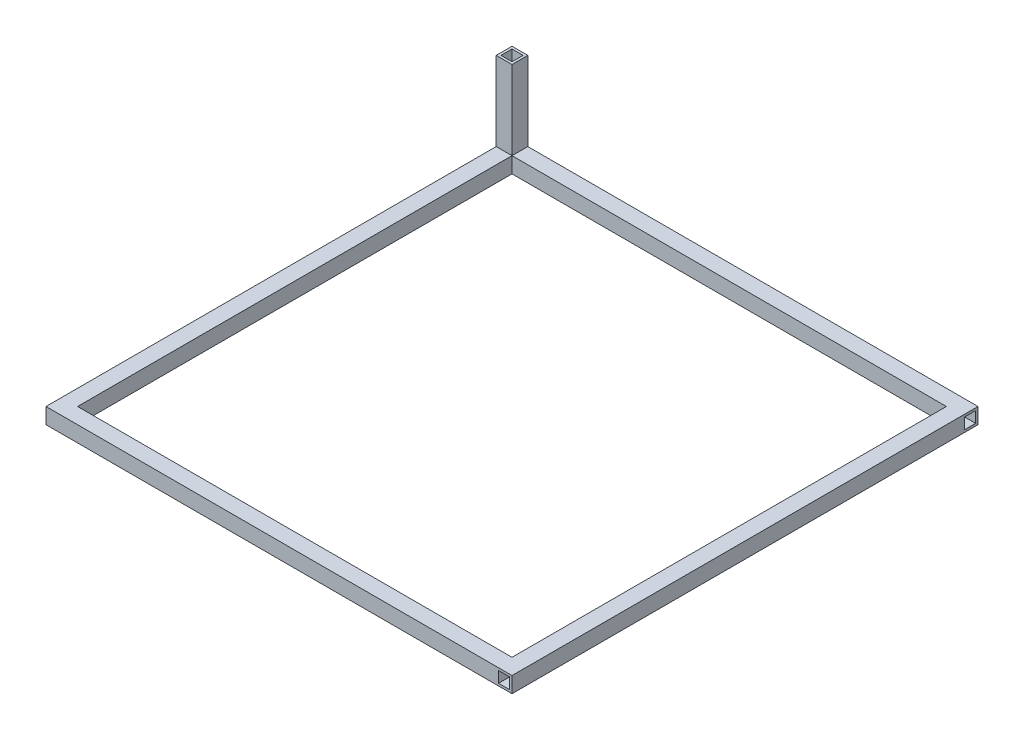
ISO-10303-21;
HEADER;
FILE_DESCRIPTION(('STEP AP214'),'2;1');
FILE_NAME('part.step','',(''),(''),'','','');
FILE_SCHEMA(('AUTOMOTIVE_DESIGN { 1 0 10303 214 1 1 1 1 }'));
ENDSEC;
DATA;
#1=APPLICATION_CONTEXT('core data for automotive mechanical design processes');
#2=APPLICATION_PROTOCOL_DEFINITION('international standard','automotive_design',2000,#1);
#3=PRODUCT_CONTEXT('',#1,'mechanical');
#4=PRODUCT('Part','Part','',(#3));
#5=PRODUCT_RELATED_PRODUCT_CATEGORY('part','',(#4));
#6=PRODUCT_DEFINITION_FORMATION('','',#4);
#7=PRODUCT_DEFINITION_CONTEXT('part definition',#1,'design');
#8=PRODUCT_DEFINITION('design','',#6,#7);
#9=PRODUCT_DEFINITION_SHAPE('','',#8);
#10=(LENGTH_UNIT() NAMED_UNIT(*) SI_UNIT(.MILLI.,.METRE.));
#11=(NAMED_UNIT(*) PLANE_ANGLE_UNIT() SI_UNIT($,.RADIAN.));
#12=(NAMED_UNIT(*) SI_UNIT($,.STERADIAN.) SOLID_ANGLE_UNIT());
#13=UNCERTAINTY_MEASURE_WITH_UNIT(LENGTH_MEASURE(1.E-05),#10,'distance_accuracy_value','');
#14=(GEOMETRIC_REPRESENTATION_CONTEXT(3) GLOBAL_UNCERTAINTY_ASSIGNED_CONTEXT((#13)) GLOBAL_UNIT_ASSIGNED_CONTEXT((#10,
#11,#12)) REPRESENTATION_CONTEXT('',''));
#15=CARTESIAN_POINT('',(0.,0.,0.));
#16=DIRECTION('',(0.,0.,1.));
#17=DIRECTION('',(1.,0.,0.));
#18=AXIS2_PLACEMENT_3D('',#15,#16,#17);
#19=CARTESIAN_POINT('',(500.495049504951,30.9955771126084,590.));
#20=DIRECTION('',(1.,0.,0.));
#21=DIRECTION('',(0.,0.,-1.));
#22=AXIS2_PLACEMENT_3D('',#19,#20,#21);
#23=PLANE('',#22);
#24=DIRECTION('',(0.,-1.,0.));
#25=VECTOR('',#24,1.);
#26=CARTESIAN_POINT('',(500.495049504951,30.9955771126084,570.));
#27=LINE('',#26,#25);
#28=CARTESIAN_POINT('',(500.495049504951,30.9955771126084,570.));
#29=VERTEX_POINT('',#28);
#30=CARTESIAN_POINT('',(500.495049504951,10.9955771126084,570.));
#31=VERTEX_POINT('',#30);
#32=EDGE_CURVE('E255',#29,#31,#27,.T.);
#33=ORIENTED_EDGE('',*,*,#32,.F.);
#34=DIRECTION('',(0.,0.,-1.));
#35=VECTOR('',#34,1.);
#36=CARTESIAN_POINT('',(500.495049504951,30.9955771126084,590.));
#37=LINE('',#36,#35);
#38=CARTESIAN_POINT('',(500.495049504951,30.9955771126084,20.));
#39=VERTEX_POINT('',#38);
#40=EDGE_CURVE('E330',#29,#39,#37,.T.);
#41=ORIENTED_EDGE('',*,*,#40,.T.);
#42=DIRECTION('',(0.,-1.,0.));
#43=VECTOR('',#42,1.);
#44=CARTESIAN_POINT('',(500.495049504951,30.9955771126084,20.));
#45=LINE('',#44,#43);
#46=CARTESIAN_POINT('',(500.495049504951,10.9955771126084,20.));
#47=VERTEX_POINT('',#46);
#48=EDGE_CURVE('E318',#39,#47,#45,.T.);
#49=ORIENTED_EDGE('',*,*,#48,.T.);
#50=DIRECTION('',(0.,0.,-1.));
#51=VECTOR('',#50,1.);
#52=CARTESIAN_POINT('',(500.495049504951,10.9955771126084,590.));
#53=LINE('',#52,#51);
#54=EDGE_CURVE('E60',#31,#47,#53,.T.);
#55=ORIENTED_EDGE('',*,*,#54,.F.);
#56=EDGE_LOOP('',(#33,#41,#49,#55));
#57=FACE_BOUND('',#56,.T.);
#58=ADVANCED_FACE('F37',(#57),#23,.F.);
#59=CARTESIAN_POINT('',(520.495049504951,30.9955771126084,20.));
#60=DIRECTION('',(0.,0.,-1.));
#61=DIRECTION('',(-1.,0.,0.));
#62=AXIS2_PLACEMENT_3D('',#59,#60,#61);
#63=PLANE('',#62);
#64=ORIENTED_EDGE('',*,*,#48,.F.);
#65=DIRECTION('',(-1.,0.,0.));
#66=VECTOR('',#65,1.);
#67=CARTESIAN_POINT('',(520.495049504951,30.9955771126084,20.));
#68=LINE('',#67,#66);
#69=CARTESIAN_POINT('',(-49.5049504950495,30.9955771126084,20.));
#70=VERTEX_POINT('',#69);
#71=EDGE_CURVE('E371',#39,#70,#68,.T.);
#72=ORIENTED_EDGE('',*,*,#71,.T.);
#73=DIRECTION('',(0.,-1.,0.));
#74=VECTOR('',#73,1.);
#75=CARTESIAN_POINT('',(-49.5049504950495,30.9955771126084,20.));
#76=LINE('',#75,#74);
#77=CARTESIAN_POINT('',(-49.5049504950495,10.9955771126084,20.));
#78=VERTEX_POINT('',#77);
#79=EDGE_CURVE('E362',#70,#78,#76,.T.);
#80=ORIENTED_EDGE('',*,*,#79,.T.);
#81=DIRECTION('',(-1.,0.,0.));
#82=VECTOR('',#81,1.);
#83=CARTESIAN_POINT('',(520.495049504951,10.9955771126084,20.));
#84=LINE('',#83,#82);
#85=EDGE_CURVE('E380',#47,#78,#84,.T.);
#86=ORIENTED_EDGE('',*,*,#85,.F.);
#87=EDGE_LOOP('',(#64,#72,#80,#86));
#88=FACE_BOUND('',#87,.T.);
#89=ADVANCED_FACE('F491',(#88),#63,.F.);
#90=CARTESIAN_POINT('',(-49.5049504950495,30.9955771126084,570.));
#91=DIRECTION('',(-1.,0.,0.));
#92=DIRECTION('',(0.,0.,1.));
#93=AXIS2_PLACEMENT_3D('',#90,#91,#92);
#94=PLANE('',#93);
#95=ORIENTED_EDGE('',*,*,#79,.F.);
#96=DIRECTION('',(0.,0.,-1.));
#97=VECTOR('',#96,1.);
#98=CARTESIAN_POINT('',(-49.5049504950495,30.9955771126084,570.));
#99=LINE('',#98,#97);
#100=CARTESIAN_POINT('',(-49.5049504950495,30.9955771126084,570.));
#101=VERTEX_POINT('',#100);
#102=EDGE_CURVE('E479',#101,#70,#99,.T.);
#103=ORIENTED_EDGE('',*,*,#102,.F.);
#104=DIRECTION('',(0.,1.,0.));
#105=VECTOR('',#104,1.);
#106=CARTESIAN_POINT('',(-49.5049504950495,30.9955771126084,570.));
#107=LINE('',#106,#105);
#108=CARTESIAN_POINT('',(-49.5049504950495,10.9955771126084,570.));
#109=VERTEX_POINT('',#108);
#110=EDGE_CURVE('E467',#109,#101,#107,.T.);
#111=ORIENTED_EDGE('',*,*,#110,.F.);
#112=DIRECTION('',(0.,0.,-1.));
#113=VECTOR('',#112,1.);
#114=CARTESIAN_POINT('',(-49.5049504950495,10.9955771126084,570.));
#115=LINE('',#114,#113);
#116=EDGE_CURVE('E45',#109,#78,#115,.T.);
#117=ORIENTED_EDGE('',*,*,#116,.T.);
#118=EDGE_LOOP('',(#95,#103,#111,#117));
#119=FACE_BOUND('',#118,.T.);
#120=ADVANCED_FACE('F485',(#119),#94,.F.);
#121=DIRECTION('',(0.,0.,1.));
#122=VECTOR('',#121,1.);
#123=CARTESIAN_POINT('',(-49.5049504950495,30.9955771126084,20.));
#124=LINE('',#123,#122);
#125=CARTESIAN_POINT('',(-49.5049504950495,30.9955771126084,0.));
#126=VERTEX_POINT('',#125);
#127=EDGE_CURVE('E367',#126,#70,#124,.T.);
#128=ORIENTED_EDGE('',*,*,#127,.F.);
#129=DIRECTION('',(0.,1.,0.));
#130=VECTOR('',#129,1.);
#131=CARTESIAN_POINT('',(-49.5049504950495,30.9955771126084,0.));
#132=LINE('',#131,#130);
#133=CARTESIAN_POINT('',(-49.5049504950495,130.995577112608,0.));
#134=VERTEX_POINT('',#133);
#135=EDGE_CURVE('E471',#126,#134,#132,.T.);
#136=ORIENTED_EDGE('',*,*,#135,.T.);
#137=DIRECTION('',(0.,0.,-1.));
#138=VECTOR('',#137,1.);
#139=CARTESIAN_POINT('',(-49.5049504950495,130.995577112608,0.));
#140=LINE('',#139,#138);
#141=CARTESIAN_POINT('',(-49.5049504950495,130.995577112608,20.));
#142=VERTEX_POINT('',#141);
#143=EDGE_CURVE('E418',#142,#134,#140,.T.);
#144=ORIENTED_EDGE('',*,*,#143,.F.);
#145=DIRECTION('',(0.,-1.,0.));
#146=VECTOR('',#145,1.);
#147=CARTESIAN_POINT('',(-49.5049504950495,130.995577112608,20.));
#148=LINE('',#147,#146);
#149=EDGE_CURVE('E424',#142,#70,#148,.T.);
#150=ORIENTED_EDGE('',*,*,#149,.T.);
#151=EDGE_LOOP('',(#128,#136,#144,#150));
#152=FACE_BOUND('',#151,.T.);
#153=ADVANCED_FACE('F497',(#152),#94,.F.);
#154=CARTESIAN_POINT('',(-69.5049504950495,30.9955771126084,570.));
#155=DIRECTION('',(0.,-1.,0.));
#156=DIRECTION('',(0.,0.,-1.));
#157=AXIS2_PLACEMENT_3D('',#154,#155,#156);
#158=PLANE('',#157);
#159=DIRECTION('',(1.,0.,0.));
#160=VECTOR('',#159,1.);
#161=CARTESIAN_POINT('',(-69.5049504950495,30.9955771126084,20.));
#162=LINE('',#161,#160);
#163=CARTESIAN_POINT('',(-69.5049504950495,30.9955771126084,20.));
#164=VERTEX_POINT('',#163);
#165=EDGE_CURVE('E412',#164,#70,#162,.T.);
#166=ORIENTED_EDGE('',*,*,#165,.F.);
#167=DIRECTION('',(0.,0.,-1.));
#168=VECTOR('',#167,1.);
#169=CARTESIAN_POINT('',(-69.5049504950495,30.9955771126084,570.));
#170=LINE('',#169,#168);
#171=CARTESIAN_POINT('',(-69.5049504950495,30.9955771126084,590.));
#172=VERTEX_POINT('',#171);
#173=EDGE_CURVE('E470',#172,#164,#170,.T.);
#174=ORIENTED_EDGE('',*,*,#173,.F.);
#175=DIRECTION('',(-1.,0.,0.));
#176=VECTOR('',#175,1.);
#177=CARTESIAN_POINT('',(520.495049504951,30.9955771126084,590.));
#178=LINE('',#177,#176);
#179=CARTESIAN_POINT('',(520.495049504951,30.9955771126084,590.));
#180=VERTEX_POINT('',#179);
#181=EDGE_CURVE('E322',#180,#172,#178,.T.);
#182=ORIENTED_EDGE('',*,*,#181,.F.);
#183=DIRECTION('',(0.,0.,1.));
#184=VECTOR('',#183,1.);
#185=CARTESIAN_POINT('',(520.495049504951,30.9955771126084,20.));
#186=LINE('',#185,#184);
#187=CARTESIAN_POINT('',(520.495049504951,30.9955771126084,0.));
#188=VERTEX_POINT('',#187);
#189=EDGE_CURVE('E369',#188,#180,#186,.T.);
#190=ORIENTED_EDGE('',*,*,#189,.F.);
#191=DIRECTION('',(-1.,0.,0.));
#192=VECTOR('',#191,1.);
#193=CARTESIAN_POINT('',(520.495049504951,30.9955771126084,0.));
#194=LINE('',#193,#192);
#195=EDGE_CURVE('E377',#188,#126,#194,.T.);
#196=ORIENTED_EDGE('',*,*,#195,.T.);
#197=ORIENTED_EDGE('',*,*,#127,.T.);
#198=ORIENTED_EDGE('',*,*,#71,.F.);
#199=ORIENTED_EDGE('',*,*,#40,.F.);
#200=DIRECTION('',(1.,0.,0.));
#201=VECTOR('',#200,1.);
#202=CARTESIAN_POINT('',(-69.5049504950495,30.9955771126084,570.));
#203=LINE('',#202,#201);
#204=EDGE_CURVE('E281',#101,#29,#203,.T.);
#205=ORIENTED_EDGE('',*,*,#204,.F.);
#206=ORIENTED_EDGE('',*,*,#102,.T.);
#207=EDGE_LOOP('',(#166,#174,#182,#190,#196,#197,#198,#199,#205,#206));
#208=FACE_BOUND('',#207,.T.);
#209=ADVANCED_FACE('F503',(#208),#158,.F.);
#210=CARTESIAN_POINT('',(0.,0.,0.));
#211=DIRECTION('',(0.,0.,1.));
#212=DIRECTION('',(1.,0.,0.));
#213=AXIS2_PLACEMENT_3D('',#210,#211,#212);
#214=PLANE('',#213);
#215=DIRECTION('',(0.,-1.,0.));
#216=VECTOR('',#215,1.);
#217=CARTESIAN_POINT('',(-69.5049504950495,30.9955771126084,0.));
#218=LINE('',#217,#216);
#219=CARTESIAN_POINT('',(-69.5049504950495,130.995577112608,0.));
#220=VERTEX_POINT('',#219);
#221=CARTESIAN_POINT('',(-69.5049504950495,10.9955771126084,0.));
#222=VERTEX_POINT('',#221);
#223=EDGE_CURVE('E466',#220,#222,#218,.T.);
#224=ORIENTED_EDGE('',*,*,#223,.F.);
#225=DIRECTION('',(-1.,0.,0.));
#226=VECTOR('',#225,1.);
#227=CARTESIAN_POINT('',(-69.5049504950495,130.995577112608,0.));
#228=LINE('',#227,#226);
#229=EDGE_CURVE('E421',#134,#220,#228,.T.);
#230=ORIENTED_EDGE('',*,*,#229,.F.);
#231=ORIENTED_EDGE('',*,*,#135,.F.);
#232=ORIENTED_EDGE('',*,*,#195,.F.);
#233=DIRECTION('',(0.,1.,0.));
#234=VECTOR('',#233,1.);
#235=CARTESIAN_POINT('',(520.495049504951,30.9955771126084,0.));
#236=LINE('',#235,#234);
#237=CARTESIAN_POINT('',(520.495049504951,10.9955771126084,0.));
#238=VERTEX_POINT('',#237);
#239=EDGE_CURVE('E366',#238,#188,#236,.T.);
#240=ORIENTED_EDGE('',*,*,#239,.F.);
#241=DIRECTION('',(1.,0.,0.));
#242=VECTOR('',#241,1.);
#243=CARTESIAN_POINT('',(-69.5049504950495,10.9955771126084,0.));
#244=LINE('',#243,#242);
#245=EDGE_CURVE('E474',#222,#238,#244,.T.);
#246=ORIENTED_EDGE('',*,*,#245,.F.);
#247=EDGE_LOOP('',(#224,#230,#231,#232,#240,#246));
#248=FACE_BOUND('',#247,.T.);
#249=DIRECTION('',(0.,-1.,0.));
#250=VECTOR('',#249,1.);
#251=CARTESIAN_POINT('',(-66.5049504950495,27.9955771126084,0.));
#252=LINE('',#251,#250);
#253=CARTESIAN_POINT('',(-66.5049504950495,27.9955771126084,0.));
#254=VERTEX_POINT('',#253);
#255=CARTESIAN_POINT('',(-66.5049504950495,13.9955771126084,0.));
#256=VERTEX_POINT('',#255);
#257=EDGE_CURVE('E432',#254,#256,#252,.T.);
#258=ORIENTED_EDGE('',*,*,#257,.T.);
#259=DIRECTION('',(1.,0.,0.));
#260=VECTOR('',#259,1.);
#261=CARTESIAN_POINT('',(-66.5049504950495,13.9955771126084,0.));
#262=LINE('',#261,#260);
#263=CARTESIAN_POINT('',(-52.5049504950495,13.9955771126084,0.));
#264=VERTEX_POINT('',#263);
#265=EDGE_CURVE('E449',#256,#264,#262,.T.);
#266=ORIENTED_EDGE('',*,*,#265,.T.);
#267=DIRECTION('',(0.,1.,0.));
#268=VECTOR('',#267,1.);
#269=CARTESIAN_POINT('',(-52.5049504950495,27.9955771126084,0.));
#270=LINE('',#269,#268);
#271=CARTESIAN_POINT('',(-52.5049504950495,27.9955771126084,0.));
#272=VERTEX_POINT('',#271);
#273=EDGE_CURVE('E452',#264,#272,#270,.T.);
#274=ORIENTED_EDGE('',*,*,#273,.T.);
#275=DIRECTION('',(-1.,0.,0.));
#276=VECTOR('',#275,1.);
#277=CARTESIAN_POINT('',(-66.5049504950495,27.9955771126084,0.));
#278=LINE('',#277,#276);
#279=EDGE_CURVE('E437',#272,#254,#278,.T.);
#280=ORIENTED_EDGE('',*,*,#279,.T.);
#281=EDGE_LOOP('',(#258,#266,#274,#280));
#282=FACE_BOUND('',#281,.T.);
#283=ADVANCED_FACE('F518',(#248,#282),#214,.F.);
#284=CARTESIAN_POINT('',(-69.5049504950495,30.9955771126084,570.));
#285=DIRECTION('',(1.,0.,0.));
#286=DIRECTION('',(0.,0.,-1.));
#287=AXIS2_PLACEMENT_3D('',#284,#285,#286);
#288=PLANE('',#287);
#289=ORIENTED_EDGE('',*,*,#223,.T.);
#290=DIRECTION('',(0.,0.,-1.));
#291=VECTOR('',#290,1.);
#292=CARTESIAN_POINT('',(-69.5049504950495,10.9955771126084,570.));
#293=LINE('',#292,#291);
#294=CARTESIAN_POINT('',(-69.5049504950495,10.9955771126084,590.));
#295=VERTEX_POINT('',#294);
#296=EDGE_CURVE('E11',#295,#222,#293,.T.);
#297=ORIENTED_EDGE('',*,*,#296,.F.);
#298=DIRECTION('',(0.,1.,0.));
#299=VECTOR('',#298,1.);
#300=CARTESIAN_POINT('',(-69.5049504950495,30.9955771126084,590.));
#301=LINE('',#300,#299);
#302=EDGE_CURVE('E278',#295,#172,#301,.T.);
#303=ORIENTED_EDGE('',*,*,#302,.T.);
#304=ORIENTED_EDGE('',*,*,#173,.T.);
#305=DIRECTION('',(0.,-1.,0.));
#306=VECTOR('',#305,1.);
#307=CARTESIAN_POINT('',(-69.5049504950495,130.995577112608,20.));
#308=LINE('',#307,#306);
#309=CARTESIAN_POINT('',(-69.5049504950495,130.995577112608,20.));
#310=VERTEX_POINT('',#309);
#311=EDGE_CURVE('E429',#310,#164,#308,.T.);
#312=ORIENTED_EDGE('',*,*,#311,.F.);
#313=DIRECTION('',(0.,0.,1.));
#314=VECTOR('',#313,1.);
#315=CARTESIAN_POINT('',(-69.5049504950495,130.995577112608,0.));
#316=LINE('',#315,#314);
#317=EDGE_CURVE('E413',#220,#310,#316,.T.);
#318=ORIENTED_EDGE('',*,*,#317,.F.);
#319=EDGE_LOOP('',(#289,#297,#303,#304,#312,#318));
#320=FACE_BOUND('',#319,.T.);
#321=DIRECTION('',(0.,0.,1.));
#322=VECTOR('',#321,1.);
#323=CARTESIAN_POINT('',(-69.5049504950495,13.9955771126084,573.));
#324=LINE('',#323,#322);
#325=CARTESIAN_POINT('',(-69.5049504950495,13.9955771126084,573.));
#326=VERTEX_POINT('',#325);
#327=CARTESIAN_POINT('',(-69.5049504950495,13.9955771126084,587.));
#328=VERTEX_POINT('',#327);
#329=EDGE_CURVE('E247',#326,#328,#324,.T.);
#330=ORIENTED_EDGE('',*,*,#329,.F.);
#331=DIRECTION('',(0.,-1.,0.));
#332=VECTOR('',#331,1.);
#333=CARTESIAN_POINT('',(-69.5049504950495,27.9955771126084,573.));
#334=LINE('',#333,#332);
#335=CARTESIAN_POINT('',(-69.5049504950495,27.9955771126084,573.));
#336=VERTEX_POINT('',#335);
#337=EDGE_CURVE('E239',#336,#326,#334,.T.);
#338=ORIENTED_EDGE('',*,*,#337,.F.);
#339=DIRECTION('',(0.,0.,-1.));
#340=VECTOR('',#339,1.);
#341=CARTESIAN_POINT('',(-69.5049504950495,27.9955771126084,573.));
#342=LINE('',#341,#340);
#343=CARTESIAN_POINT('',(-69.5049504950495,27.9955771126084,587.));
#344=VERTEX_POINT('',#343);
#345=EDGE_CURVE('E262',#344,#336,#342,.T.);
#346=ORIENTED_EDGE('',*,*,#345,.F.);
#347=DIRECTION('',(0.,1.,0.));
#348=VECTOR('',#347,1.);
#349=CARTESIAN_POINT('',(-69.5049504950495,27.9955771126084,587.));
#350=LINE('',#349,#348);
#351=EDGE_CURVE('E260',#328,#344,#350,.T.);
#352=ORIENTED_EDGE('',*,*,#351,.F.);
#353=EDGE_LOOP('',(#330,#338,#346,#352));
#354=FACE_BOUND('',#353,.T.);
#355=ADVANCED_FACE('F39',(#320,#354),#288,.F.);
#356=CARTESIAN_POINT('',(-69.5049504950495,10.9955771126084,570.));
#357=DIRECTION('',(0.,1.,0.));
#358=DIRECTION('',(0.,0.,1.));
#359=AXIS2_PLACEMENT_3D('',#356,#357,#358);
#360=PLANE('',#359);
#361=ORIENTED_EDGE('',*,*,#116,.F.);
#362=DIRECTION('',(1.,0.,0.));
#363=VECTOR('',#362,1.);
#364=CARTESIAN_POINT('',(-69.5049504950495,10.9955771126084,570.));
#365=LINE('',#364,#363);
#366=EDGE_CURVE('E286',#109,#31,#365,.T.);
#367=ORIENTED_EDGE('',*,*,#366,.T.);
#368=ORIENTED_EDGE('',*,*,#54,.T.);
#369=ORIENTED_EDGE('',*,*,#85,.T.);
#370=EDGE_LOOP('',(#361,#367,#368,#369));
#371=FACE_BOUND('',#370,.T.);
#372=ORIENTED_EDGE('',*,*,#245,.T.);
#373=DIRECTION('',(0.,0.,-1.));
#374=VECTOR('',#373,1.);
#375=CARTESIAN_POINT('',(520.495049504951,10.9955771126084,20.));
#376=LINE('',#375,#374);
#377=CARTESIAN_POINT('',(520.495049504951,10.9955771126084,590.));
#378=VERTEX_POINT('',#377);
#379=EDGE_CURVE('E363',#378,#238,#376,.T.);
#380=ORIENTED_EDGE('',*,*,#379,.F.);
#381=DIRECTION('',(1.,0.,0.));
#382=VECTOR('',#381,1.);
#383=CARTESIAN_POINT('',(520.495049504951,10.9955771126084,590.));
#384=LINE('',#383,#382);
#385=EDGE_CURVE('E325',#295,#378,#384,.T.);
#386=ORIENTED_EDGE('',*,*,#385,.F.);
#387=ORIENTED_EDGE('',*,*,#296,.T.);
#388=EDGE_LOOP('',(#372,#380,#386,#387));
#389=FACE_BOUND('',#388,.T.);
#390=ADVANCED_FACE('F506',(#371,#389),#360,.F.);
#391=CARTESIAN_POINT('',(-66.5049504950495,27.9955771126084,570.));
#392=DIRECTION('',(1.,0.,0.));
#393=DIRECTION('',(0.,0.,-1.));
#394=AXIS2_PLACEMENT_3D('',#391,#392,#393);
#395=PLANE('',#394);
#396=ORIENTED_EDGE('',*,*,#257,.F.);
#397=DIRECTION('',(0.,0.,-1.));
#398=VECTOR('',#397,1.);
#399=CARTESIAN_POINT('',(-66.5049504950495,27.9955771126084,570.));
#400=LINE('',#399,#398);
#401=CARTESIAN_POINT('',(-66.5049504950495,27.9955771126084,570.));
#402=VERTEX_POINT('',#401);
#403=EDGE_CURVE('E446',#402,#254,#400,.T.);
#404=ORIENTED_EDGE('',*,*,#403,.F.);
#405=DIRECTION('',(0.,-1.,0.));
#406=VECTOR('',#405,1.);
#407=CARTESIAN_POINT('',(-66.5049504950495,27.9955771126084,570.));
#408=LINE('',#407,#406);
#409=CARTESIAN_POINT('',(-66.5049504950495,13.9955771126084,570.));
#410=VERTEX_POINT('',#409);
#411=EDGE_CURVE('E433',#402,#410,#408,.T.);
#412=ORIENTED_EDGE('',*,*,#411,.T.);
#413=DIRECTION('',(0.,0.,-1.));
#414=VECTOR('',#413,1.);
#415=CARTESIAN_POINT('',(-66.5049504950495,13.9955771126084,570.));
#416=LINE('',#415,#414);
#417=EDGE_CURVE('E463',#410,#256,#416,.T.);
#418=ORIENTED_EDGE('',*,*,#417,.T.);
#419=EDGE_LOOP('',(#396,#404,#412,#418));
#420=FACE_BOUND('',#419,.T.);
#421=ADVANCED_FACE('F509',(#420),#395,.T.);
#422=CARTESIAN_POINT('',(-66.5049504950495,13.9955771126084,570.));
#423=DIRECTION('',(0.,1.,0.));
#424=DIRECTION('',(0.,0.,1.));
#425=AXIS2_PLACEMENT_3D('',#422,#423,#424);
#426=PLANE('',#425);
#427=ORIENTED_EDGE('',*,*,#265,.F.);
#428=ORIENTED_EDGE('',*,*,#417,.F.);
#429=DIRECTION('',(1.,0.,0.));
#430=VECTOR('',#429,1.);
#431=CARTESIAN_POINT('',(-66.5049504950495,13.9955771126084,570.));
#432=LINE('',#431,#430);
#433=CARTESIAN_POINT('',(-52.5049504950495,13.9955771126084,570.));
#434=VERTEX_POINT('',#433);
#435=EDGE_CURVE('E436',#410,#434,#432,.T.);
#436=ORIENTED_EDGE('',*,*,#435,.T.);
#437=DIRECTION('',(0.,0.,-1.));
#438=VECTOR('',#437,1.);
#439=CARTESIAN_POINT('',(-52.5049504950495,13.9955771126084,570.));
#440=LINE('',#439,#438);
#441=EDGE_CURVE('E461',#434,#264,#440,.T.);
#442=ORIENTED_EDGE('',*,*,#441,.T.);
#443=EDGE_LOOP('',(#427,#428,#436,#442));
#444=FACE_BOUND('',#443,.T.);
#445=ADVANCED_FACE('F636',(#444),#426,.T.);
#446=CARTESIAN_POINT('',(-52.5049504950495,27.9955771126084,570.));
#447=DIRECTION('',(-1.,0.,0.));
#448=DIRECTION('',(0.,-1.,0.));
#449=AXIS2_PLACEMENT_3D('',#446,#447,#448);
#450=PLANE('',#449);
#451=ORIENTED_EDGE('',*,*,#273,.F.);
#452=ORIENTED_EDGE('',*,*,#441,.F.);
#453=DIRECTION('',(0.,1.,0.));
#454=VECTOR('',#453,1.);
#455=CARTESIAN_POINT('',(-52.5049504950495,27.9955771126084,570.));
#456=LINE('',#455,#454);
#457=CARTESIAN_POINT('',(-52.5049504950495,27.9955771126084,570.));
#458=VERTEX_POINT('',#457);
#459=EDGE_CURVE('E440',#434,#458,#456,.T.);
#460=ORIENTED_EDGE('',*,*,#459,.T.);
#461=DIRECTION('',(0.,0.,-1.));
#462=VECTOR('',#461,1.);
#463=CARTESIAN_POINT('',(-52.5049504950495,27.9955771126084,570.));
#464=LINE('',#463,#462);
#465=EDGE_CURVE('E459',#458,#272,#464,.T.);
#466=ORIENTED_EDGE('',*,*,#465,.T.);
#467=EDGE_LOOP('',(#451,#452,#460,#466));
#468=FACE_BOUND('',#467,.T.);
#469=ADVANCED_FACE('F640',(#468),#450,.T.);
#470=CARTESIAN_POINT('',(-66.5049504950495,27.9955771126084,570.));
#471=DIRECTION('',(0.,-1.,0.));
#472=DIRECTION('',(0.,0.,-1.));
#473=AXIS2_PLACEMENT_3D('',#470,#471,#472);
#474=PLANE('',#473);
#475=ORIENTED_EDGE('',*,*,#279,.F.);
#476=ORIENTED_EDGE('',*,*,#465,.F.);
#477=DIRECTION('',(-1.,0.,0.));
#478=VECTOR('',#477,1.);
#479=CARTESIAN_POINT('',(-66.5049504950495,27.9955771126084,570.));
#480=LINE('',#479,#478);
#481=EDGE_CURVE('E443',#458,#402,#480,.T.);
#482=ORIENTED_EDGE('',*,*,#481,.T.);
#483=ORIENTED_EDGE('',*,*,#403,.T.);
#484=EDGE_LOOP('',(#475,#476,#482,#483));
#485=FACE_BOUND('',#484,.T.);
#486=ADVANCED_FACE('F533',(#485),#474,.T.);
#487=CARTESIAN_POINT('',(0.,130.995577112608,0.));
#488=DIRECTION('',(0.,1.,0.));
#489=DIRECTION('',(0.,0.,1.));
#490=AXIS2_PLACEMENT_3D('',#487,#488,#489);
#491=PLANE('',#490);
#492=ORIENTED_EDGE('',*,*,#317,.T.);
#493=DIRECTION('',(1.,0.,0.));
#494=VECTOR('',#493,1.);
#495=CARTESIAN_POINT('',(-69.5049504950495,130.995577112608,20.));
#496=LINE('',#495,#494);
#497=EDGE_CURVE('E416',#310,#142,#496,.T.);
#498=ORIENTED_EDGE('',*,*,#497,.T.);
#499=ORIENTED_EDGE('',*,*,#143,.T.);
#500=ORIENTED_EDGE('',*,*,#229,.T.);
#501=EDGE_LOOP('',(#492,#498,#499,#500));
#502=FACE_BOUND('',#501,.T.);
#503=DIRECTION('',(1.,0.,0.));
#504=VECTOR('',#503,1.);
#505=CARTESIAN_POINT('',(-66.5049504950495,130.995577112608,17.));
#506=LINE('',#505,#504);
#507=CARTESIAN_POINT('',(-66.5049504950495,130.995577112608,17.));
#508=VERTEX_POINT('',#507);
#509=CARTESIAN_POINT('',(-52.5049504950495,130.995577112608,17.));
#510=VERTEX_POINT('',#509);
#511=EDGE_CURVE('E385',#508,#510,#506,.T.);
#512=ORIENTED_EDGE('',*,*,#511,.F.);
#513=DIRECTION('',(0.,0.,1.));
#514=VECTOR('',#513,1.);
#515=CARTESIAN_POINT('',(-66.5049504950495,130.995577112608,3.));
#516=LINE('',#515,#514);
#517=CARTESIAN_POINT('',(-66.5049504950495,130.995577112608,3.));
#518=VERTEX_POINT('',#517);
#519=EDGE_CURVE('E383',#518,#508,#516,.T.);
#520=ORIENTED_EDGE('',*,*,#519,.F.);
#521=DIRECTION('',(-1.,0.,0.));
#522=VECTOR('',#521,1.);
#523=CARTESIAN_POINT('',(-66.5049504950495,130.995577112608,3.));
#524=LINE('',#523,#522);
#525=CARTESIAN_POINT('',(-52.5049504950495,130.995577112608,3.));
#526=VERTEX_POINT('',#525);
#527=EDGE_CURVE('E391',#526,#518,#524,.T.);
#528=ORIENTED_EDGE('',*,*,#527,.F.);
#529=DIRECTION('',(0.,0.,-1.));
#530=VECTOR('',#529,1.);
#531=CARTESIAN_POINT('',(-52.5049504950495,130.995577112608,3.));
#532=LINE('',#531,#530);
#533=EDGE_CURVE('E388',#510,#526,#532,.T.);
#534=ORIENTED_EDGE('',*,*,#533,.F.);
#535=EDGE_LOOP('',(#512,#520,#528,#534));
#536=FACE_BOUND('',#535,.T.);
#537=ADVANCED_FACE('F530',(#502,#536),#491,.T.);
#538=CARTESIAN_POINT('',(-69.5049504950495,130.995577112608,20.));
#539=DIRECTION('',(0.,0.,-1.));
#540=DIRECTION('',(-1.,0.,0.));
#541=AXIS2_PLACEMENT_3D('',#538,#539,#540);
#542=PLANE('',#541);
#543=ORIENTED_EDGE('',*,*,#165,.T.);
#544=ORIENTED_EDGE('',*,*,#149,.F.);
#545=ORIENTED_EDGE('',*,*,#497,.F.);
#546=ORIENTED_EDGE('',*,*,#311,.T.);
#547=EDGE_LOOP('',(#543,#544,#545,#546));
#548=FACE_BOUND('',#547,.T.);
#549=ADVANCED_FACE('F500',(#548),#542,.F.);
#550=CARTESIAN_POINT('',(-66.5049504950495,130.995577112608,3.));
#551=DIRECTION('',(1.,0.,0.));
#552=DIRECTION('',(0.,0.,-1.));
#553=AXIS2_PLACEMENT_3D('',#550,#551,#552);
#554=PLANE('',#553);
#555=DIRECTION('',(0.,0.,1.));
#556=VECTOR('',#555,1.);
#557=CARTESIAN_POINT('',(-66.5049504950495,30.9955771126084,3.));
#558=LINE('',#557,#556);
#559=CARTESIAN_POINT('',(-66.5049504950495,30.9955771126084,3.));
#560=VERTEX_POINT('',#559);
#561=CARTESIAN_POINT('',(-66.5049504950495,30.9955771126084,17.));
#562=VERTEX_POINT('',#561);
#563=EDGE_CURVE('E382',#560,#562,#558,.T.);
#564=ORIENTED_EDGE('',*,*,#563,.F.);
#565=DIRECTION('',(0.,-1.,0.));
#566=VECTOR('',#565,1.);
#567=CARTESIAN_POINT('',(-66.5049504950495,130.995577112608,3.));
#568=LINE('',#567,#566);
#569=EDGE_CURVE('E393',#518,#560,#568,.T.);
#570=ORIENTED_EDGE('',*,*,#569,.F.);
#571=ORIENTED_EDGE('',*,*,#519,.T.);
#572=DIRECTION('',(0.,-1.,0.));
#573=VECTOR('',#572,1.);
#574=CARTESIAN_POINT('',(-66.5049504950495,130.995577112608,17.));
#575=LINE('',#574,#573);
#576=EDGE_CURVE('E409',#508,#562,#575,.T.);
#577=ORIENTED_EDGE('',*,*,#576,.T.);
#578=EDGE_LOOP('',(#564,#570,#571,#577));
#579=FACE_BOUND('',#578,.T.);
#580=ADVANCED_FACE('F551',(#579),#554,.T.);
#581=CARTESIAN_POINT('',(-66.5049504950495,130.995577112608,17.));
#582=DIRECTION('',(0.,0.,-1.));
#583=DIRECTION('',(-1.,0.,0.));
#584=AXIS2_PLACEMENT_3D('',#581,#582,#583);
#585=PLANE('',#584);
#586=DIRECTION('',(1.,0.,0.));
#587=VECTOR('',#586,1.);
#588=CARTESIAN_POINT('',(-66.5049504950495,30.9955771126084,17.));
#589=LINE('',#588,#587);
#590=CARTESIAN_POINT('',(-52.5049504950495,30.9955771126084,17.));
#591=VERTEX_POINT('',#590);
#592=EDGE_CURVE('E396',#562,#591,#589,.T.);
#593=ORIENTED_EDGE('',*,*,#592,.F.);
#594=ORIENTED_EDGE('',*,*,#576,.F.);
#595=ORIENTED_EDGE('',*,*,#511,.T.);
#596=DIRECTION('',(0.,-1.,0.));
#597=VECTOR('',#596,1.);
#598=CARTESIAN_POINT('',(-52.5049504950495,130.995577112608,17.));
#599=LINE('',#598,#597);
#600=EDGE_CURVE('E407',#510,#591,#599,.T.);
#601=ORIENTED_EDGE('',*,*,#600,.T.);
#602=EDGE_LOOP('',(#593,#594,#595,#601));
#603=FACE_BOUND('',#602,.T.);
#604=ADVANCED_FACE('F542',(#603),#585,.T.);
#605=CARTESIAN_POINT('',(-52.5049504950495,130.995577112608,3.));
#606=DIRECTION('',(-1.,0.,0.));
#607=DIRECTION('',(0.,0.,1.));
#608=AXIS2_PLACEMENT_3D('',#605,#606,#607);
#609=PLANE('',#608);
#610=DIRECTION('',(0.,0.,-1.));
#611=VECTOR('',#610,1.);
#612=CARTESIAN_POINT('',(-52.5049504950495,30.9955771126084,3.));
#613=LINE('',#612,#611);
#614=CARTESIAN_POINT('',(-52.5049504950495,30.9955771126084,3.));
#615=VERTEX_POINT('',#614);
#616=EDGE_CURVE('E399',#591,#615,#613,.T.);
#617=ORIENTED_EDGE('',*,*,#616,.F.);
#618=ORIENTED_EDGE('',*,*,#600,.F.);
#619=ORIENTED_EDGE('',*,*,#533,.T.);
#620=DIRECTION('',(0.,-1.,0.));
#621=VECTOR('',#620,1.);
#622=CARTESIAN_POINT('',(-52.5049504950495,130.995577112608,3.));
#623=LINE('',#622,#621);
#624=EDGE_CURVE('E405',#526,#615,#623,.T.);
#625=ORIENTED_EDGE('',*,*,#624,.T.);
#626=EDGE_LOOP('',(#617,#618,#619,#625));
#627=FACE_BOUND('',#626,.T.);
#628=ADVANCED_FACE('F545',(#627),#609,.T.);
#629=CARTESIAN_POINT('',(-66.5049504950495,130.995577112608,3.));
#630=DIRECTION('',(0.,0.,1.));
#631=DIRECTION('',(1.,0.,0.));
#632=AXIS2_PLACEMENT_3D('',#629,#630,#631);
#633=PLANE('',#632);
#634=DIRECTION('',(-1.,0.,0.));
#635=VECTOR('',#634,1.);
#636=CARTESIAN_POINT('',(-66.5049504950495,30.9955771126084,3.));
#637=LINE('',#636,#635);
#638=EDGE_CURVE('E386',#615,#560,#637,.T.);
#639=ORIENTED_EDGE('',*,*,#638,.F.);
#640=ORIENTED_EDGE('',*,*,#624,.F.);
#641=ORIENTED_EDGE('',*,*,#527,.T.);
#642=ORIENTED_EDGE('',*,*,#569,.T.);
#643=EDGE_LOOP('',(#639,#640,#641,#642));
#644=FACE_BOUND('',#643,.T.);
#645=ADVANCED_FACE('F554',(#644),#633,.T.);
#646=ORIENTED_EDGE('',*,*,#638,.T.);
#647=ORIENTED_EDGE('',*,*,#563,.T.);
#648=ORIENTED_EDGE('',*,*,#592,.T.);
#649=ORIENTED_EDGE('',*,*,#616,.T.);
#650=EDGE_LOOP('',(#646,#647,#648,#649));
#651=FACE_BOUND('',#650,.T.);
#652=ADVANCED_FACE('F548',(#651),#158,.F.);
#653=CARTESIAN_POINT('',(520.495049504951,0.,0.));
#654=DIRECTION('',(1.,0.,0.));
#655=DIRECTION('',(0.,0.,-1.));
#656=AXIS2_PLACEMENT_3D('',#653,#654,#655);
#657=PLANE('',#656);
#658=ORIENTED_EDGE('',*,*,#189,.T.);
#659=DIRECTION('',(0.,1.,0.));
#660=VECTOR('',#659,1.);
#661=CARTESIAN_POINT('',(520.495049504951,30.9955771126084,590.));
#662=LINE('',#661,#660);
#663=EDGE_CURVE('E319',#378,#180,#662,.T.);
#664=ORIENTED_EDGE('',*,*,#663,.F.);
#665=ORIENTED_EDGE('',*,*,#379,.T.);
#666=ORIENTED_EDGE('',*,*,#239,.T.);
#667=EDGE_LOOP('',(#658,#664,#665,#666));
#668=FACE_BOUND('',#667,.T.);
#669=DIRECTION('',(0.,0.,-1.));
#670=VECTOR('',#669,1.);
#671=CARTESIAN_POINT('',(520.495049504951,13.9955771126084,17.));
#672=LINE('',#671,#670);
#673=CARTESIAN_POINT('',(520.495049504951,13.9955771126084,17.));
#674=VERTEX_POINT('',#673);
#675=CARTESIAN_POINT('',(520.495049504951,13.9955771126084,3.00000000000002));
#676=VERTEX_POINT('',#675);
#677=EDGE_CURVE('E335',#674,#676,#672,.T.);
#678=ORIENTED_EDGE('',*,*,#677,.F.);
#679=DIRECTION('',(0.,-1.,0.));
#680=VECTOR('',#679,1.);
#681=CARTESIAN_POINT('',(520.495049504951,27.9955771126084,17.));
#682=LINE('',#681,#680);
#683=CARTESIAN_POINT('',(520.495049504951,27.9955771126084,17.));
#684=VERTEX_POINT('',#683);
#685=EDGE_CURVE('E333',#684,#674,#682,.T.);
#686=ORIENTED_EDGE('',*,*,#685,.F.);
#687=DIRECTION('',(0.,0.,1.));
#688=VECTOR('',#687,1.);
#689=CARTESIAN_POINT('',(520.495049504951,27.9955771126084,17.));
#690=LINE('',#689,#688);
#691=CARTESIAN_POINT('',(520.495049504951,27.9955771126084,3.00000000000002));
#692=VERTEX_POINT('',#691);
#693=EDGE_CURVE('E341',#692,#684,#690,.T.);
#694=ORIENTED_EDGE('',*,*,#693,.F.);
#695=DIRECTION('',(0.,1.,0.));
#696=VECTOR('',#695,1.);
#697=CARTESIAN_POINT('',(520.495049504951,27.9955771126084,3.00000000000002));
#698=LINE('',#697,#696);
#699=EDGE_CURVE('E338',#676,#692,#698,.T.);
#700=ORIENTED_EDGE('',*,*,#699,.F.);
#701=EDGE_LOOP('',(#678,#686,#694,#700));
#702=FACE_BOUND('',#701,.T.);
#703=ADVANCED_FACE('F515',(#668,#702),#657,.T.);
#704=CARTESIAN_POINT('',(520.495049504951,27.9955771126084,17.));
#705=DIRECTION('',(0.,0.,-1.));
#706=DIRECTION('',(-1.,0.,0.));
#707=AXIS2_PLACEMENT_3D('',#704,#705,#706);
#708=PLANE('',#707);
#709=DIRECTION('',(0.,-1.,0.));
#710=VECTOR('',#709,1.);
#711=CARTESIAN_POINT('',(-49.5049504950495,27.9955771126084,17.));
#712=LINE('',#711,#710);
#713=CARTESIAN_POINT('',(-49.5049504950495,27.9955771126084,17.));
#714=VERTEX_POINT('',#713);
#715=CARTESIAN_POINT('',(-49.5049504950495,13.9955771126084,17.));
#716=VERTEX_POINT('',#715);
#717=EDGE_CURVE('E332',#714,#716,#712,.T.);
#718=ORIENTED_EDGE('',*,*,#717,.F.);
#719=DIRECTION('',(-1.,0.,0.));
#720=VECTOR('',#719,1.);
#721=CARTESIAN_POINT('',(520.495049504951,27.9955771126084,17.));
#722=LINE('',#721,#720);
#723=EDGE_CURVE('E343',#684,#714,#722,.T.);
#724=ORIENTED_EDGE('',*,*,#723,.F.);
#725=ORIENTED_EDGE('',*,*,#685,.T.);
#726=DIRECTION('',(-1.,0.,0.));
#727=VECTOR('',#726,1.);
#728=CARTESIAN_POINT('',(520.495049504951,13.9955771126084,17.));
#729=LINE('',#728,#727);
#730=EDGE_CURVE('E359',#674,#716,#729,.T.);
#731=ORIENTED_EDGE('',*,*,#730,.T.);
#732=EDGE_LOOP('',(#718,#724,#725,#731));
#733=FACE_BOUND('',#732,.T.);
#734=ADVANCED_FACE('F695',(#733),#708,.T.);
#735=CARTESIAN_POINT('',(520.495049504951,13.9955771126084,17.));
#736=DIRECTION('',(0.,1.,0.));
#737=DIRECTION('',(0.,0.,1.));
#738=AXIS2_PLACEMENT_3D('',#735,#736,#737);
#739=PLANE('',#738);
#740=DIRECTION('',(0.,0.,-1.));
#741=VECTOR('',#740,1.);
#742=CARTESIAN_POINT('',(-49.5049504950495,13.9955771126084,17.));
#743=LINE('',#742,#741);
#744=CARTESIAN_POINT('',(-49.5049504950495,13.9955771126084,3.00000000000002));
#745=VERTEX_POINT('',#744);
#746=EDGE_CURVE('E346',#716,#745,#743,.T.);
#747=ORIENTED_EDGE('',*,*,#746,.F.);
#748=ORIENTED_EDGE('',*,*,#730,.F.);
#749=ORIENTED_EDGE('',*,*,#677,.T.);
#750=DIRECTION('',(-1.,0.,0.));
#751=VECTOR('',#750,1.);
#752=CARTESIAN_POINT('',(520.495049504951,13.9955771126084,3.00000000000002));
#753=LINE('',#752,#751);
#754=EDGE_CURVE('E357',#676,#745,#753,.T.);
#755=ORIENTED_EDGE('',*,*,#754,.T.);
#756=EDGE_LOOP('',(#747,#748,#749,#755));
#757=FACE_BOUND('',#756,.T.);
#758=ADVANCED_FACE('F700',(#757),#739,.T.);
#759=CARTESIAN_POINT('',(520.495049504951,27.9955771126084,3.00000000000002));
#760=DIRECTION('',(0.,0.,1.));
#761=DIRECTION('',(0.,-1.,0.));
#762=AXIS2_PLACEMENT_3D('',#759,#760,#761);
#763=PLANE('',#762);
#764=DIRECTION('',(0.,1.,0.));
#765=VECTOR('',#764,1.);
#766=CARTESIAN_POINT('',(-49.5049504950495,27.9955771126084,3.00000000000002));
#767=LINE('',#766,#765);
#768=CARTESIAN_POINT('',(-49.5049504950495,27.9955771126084,3.00000000000002));
#769=VERTEX_POINT('',#768);
#770=EDGE_CURVE('E349',#745,#769,#767,.T.);
#771=ORIENTED_EDGE('',*,*,#770,.F.);
#772=ORIENTED_EDGE('',*,*,#754,.F.);
#773=ORIENTED_EDGE('',*,*,#699,.T.);
#774=DIRECTION('',(-1.,0.,0.));
#775=VECTOR('',#774,1.);
#776=CARTESIAN_POINT('',(520.495049504951,27.9955771126084,3.00000000000002));
#777=LINE('',#776,#775);
#778=EDGE_CURVE('E355',#692,#769,#777,.T.);
#779=ORIENTED_EDGE('',*,*,#778,.T.);
#780=EDGE_LOOP('',(#771,#772,#773,#779));
#781=FACE_BOUND('',#780,.T.);
#782=ADVANCED_FACE('F622',(#781),#763,.T.);
#783=CARTESIAN_POINT('',(520.495049504951,27.9955771126084,17.));
#784=DIRECTION('',(0.,-1.,0.));
#785=DIRECTION('',(0.,0.,-1.));
#786=AXIS2_PLACEMENT_3D('',#783,#784,#785);
#787=PLANE('',#786);
#788=DIRECTION('',(0.,0.,1.));
#789=VECTOR('',#788,1.);
#790=CARTESIAN_POINT('',(-49.5049504950495,27.9955771126084,17.));
#791=LINE('',#790,#789);
#792=EDGE_CURVE('E336',#769,#714,#791,.T.);
#793=ORIENTED_EDGE('',*,*,#792,.F.);
#794=ORIENTED_EDGE('',*,*,#778,.F.);
#795=ORIENTED_EDGE('',*,*,#693,.T.);
#796=ORIENTED_EDGE('',*,*,#723,.T.);
#797=EDGE_LOOP('',(#793,#794,#795,#796));
#798=FACE_BOUND('',#797,.T.);
#799=ADVANCED_FACE('F616',(#798),#787,.T.);
#800=ORIENTED_EDGE('',*,*,#792,.T.);
#801=ORIENTED_EDGE('',*,*,#717,.T.);
#802=ORIENTED_EDGE('',*,*,#746,.T.);
#803=ORIENTED_EDGE('',*,*,#770,.T.);
#804=EDGE_LOOP('',(#800,#801,#802,#803));
#805=FACE_BOUND('',#804,.T.);
#806=ADVANCED_FACE('F612',(#805),#94,.F.);
#807=CARTESIAN_POINT('',(0.,0.,590.));
#808=DIRECTION('',(0.,0.,-1.));
#809=DIRECTION('',(-1.,0.,0.));
#810=AXIS2_PLACEMENT_3D('',#807,#808,#809);
#811=PLANE('',#810);
#812=ORIENTED_EDGE('',*,*,#663,.T.);
#813=ORIENTED_EDGE('',*,*,#181,.T.);
#814=ORIENTED_EDGE('',*,*,#302,.F.);
#815=ORIENTED_EDGE('',*,*,#385,.T.);
#816=EDGE_LOOP('',(#812,#813,#814,#815));
#817=FACE_BOUND('',#816,.T.);
#818=DIRECTION('',(0.,-1.,0.));
#819=VECTOR('',#818,1.);
#820=CARTESIAN_POINT('',(503.495049504951,27.9955771126084,590.));
#821=LINE('',#820,#819);
#822=CARTESIAN_POINT('',(503.495049504951,27.9955771126084,590.));
#823=VERTEX_POINT('',#822);
#824=CARTESIAN_POINT('',(503.495049504951,13.9955771126084,590.));
#825=VERTEX_POINT('',#824);
#826=EDGE_CURVE('E289',#823,#825,#821,.T.);
#827=ORIENTED_EDGE('',*,*,#826,.F.);
#828=DIRECTION('',(-1.,0.,0.));
#829=VECTOR('',#828,1.);
#830=CARTESIAN_POINT('',(503.495049504951,27.9955771126084,590.));
#831=LINE('',#830,#829);
#832=CARTESIAN_POINT('',(517.495049504951,27.9955771126084,590.));
#833=VERTEX_POINT('',#832);
#834=EDGE_CURVE('E297',#833,#823,#831,.T.);
#835=ORIENTED_EDGE('',*,*,#834,.F.);
#836=DIRECTION('',(0.,1.,0.));
#837=VECTOR('',#836,1.);
#838=CARTESIAN_POINT('',(517.495049504951,27.9955771126084,590.));
#839=LINE('',#838,#837);
#840=CARTESIAN_POINT('',(517.495049504951,13.9955771126084,590.));
#841=VERTEX_POINT('',#840);
#842=EDGE_CURVE('E294',#841,#833,#839,.T.);
#843=ORIENTED_EDGE('',*,*,#842,.F.);
#844=DIRECTION('',(1.,0.,0.));
#845=VECTOR('',#844,1.);
#846=CARTESIAN_POINT('',(503.495049504951,13.9955771126084,590.));
#847=LINE('',#846,#845);
#848=EDGE_CURVE('E291',#825,#841,#847,.T.);
#849=ORIENTED_EDGE('',*,*,#848,.F.);
#850=EDGE_LOOP('',(#827,#835,#843,#849));
#851=FACE_BOUND('',#850,.T.);
#852=ADVANCED_FACE('F525',(#817,#851),#811,.F.);
#853=CARTESIAN_POINT('',(503.495049504951,27.9955771126084,590.));
#854=DIRECTION('',(1.,0.,0.));
#855=DIRECTION('',(0.,0.,-1.));
#856=AXIS2_PLACEMENT_3D('',#853,#854,#855);
#857=PLANE('',#856);
#858=DIRECTION('',(0.,-1.,0.));
#859=VECTOR('',#858,1.);
#860=CARTESIAN_POINT('',(503.495049504951,27.9955771126084,20.));
#861=LINE('',#860,#859);
#862=CARTESIAN_POINT('',(503.495049504951,27.9955771126084,20.));
#863=VERTEX_POINT('',#862);
#864=CARTESIAN_POINT('',(503.495049504951,13.9955771126084,20.));
#865=VERTEX_POINT('',#864);
#866=EDGE_CURVE('E288',#863,#865,#861,.T.);
#867=ORIENTED_EDGE('',*,*,#866,.F.);
#868=DIRECTION('',(0.,0.,-1.));
#869=VECTOR('',#868,1.);
#870=CARTESIAN_POINT('',(503.495049504951,27.9955771126084,590.));
#871=LINE('',#870,#869);
#872=EDGE_CURVE('E299',#823,#863,#871,.T.);
#873=ORIENTED_EDGE('',*,*,#872,.F.);
#874=ORIENTED_EDGE('',*,*,#826,.T.);
#875=DIRECTION('',(0.,0.,-1.));
#876=VECTOR('',#875,1.);
#877=CARTESIAN_POINT('',(503.495049504951,13.9955771126084,590.));
#878=LINE('',#877,#876);
#879=EDGE_CURVE('E315',#825,#865,#878,.T.);
#880=ORIENTED_EDGE('',*,*,#879,.T.);
#881=EDGE_LOOP('',(#867,#873,#874,#880));
#882=FACE_BOUND('',#881,.T.);
#883=ADVANCED_FACE('F607',(#882),#857,.T.);
#884=CARTESIAN_POINT('',(503.495049504951,13.9955771126084,590.));
#885=DIRECTION('',(0.,1.,0.));
#886=DIRECTION('',(0.,0.,1.));
#887=AXIS2_PLACEMENT_3D('',#884,#885,#886);
#888=PLANE('',#887);
#889=DIRECTION('',(1.,0.,0.));
#890=VECTOR('',#889,1.);
#891=CARTESIAN_POINT('',(503.495049504951,13.9955771126084,20.));
#892=LINE('',#891,#890);
#893=CARTESIAN_POINT('',(517.495049504951,13.9955771126084,20.));
#894=VERTEX_POINT('',#893);
#895=EDGE_CURVE('E302',#865,#894,#892,.T.);
#896=ORIENTED_EDGE('',*,*,#895,.F.);
#897=ORIENTED_EDGE('',*,*,#879,.F.);
#898=ORIENTED_EDGE('',*,*,#848,.T.);
#899=DIRECTION('',(0.,0.,-1.));
#900=VECTOR('',#899,1.);
#901=CARTESIAN_POINT('',(517.495049504951,13.9955771126084,590.));
#902=LINE('',#901,#900);
#903=EDGE_CURVE('E313',#841,#894,#902,.T.);
#904=ORIENTED_EDGE('',*,*,#903,.T.);
#905=EDGE_LOOP('',(#896,#897,#898,#904));
#906=FACE_BOUND('',#905,.T.);
#907=ADVANCED_FACE('F603',(#906),#888,.T.);
#908=CARTESIAN_POINT('',(517.495049504951,27.9955771126084,590.));
#909=DIRECTION('',(-1.,0.,0.));
#910=DIRECTION('',(0.,0.,1.));
#911=AXIS2_PLACEMENT_3D('',#908,#909,#910);
#912=PLANE('',#911);
#913=DIRECTION('',(0.,1.,0.));
#914=VECTOR('',#913,1.);
#915=CARTESIAN_POINT('',(517.495049504951,27.9955771126084,20.));
#916=LINE('',#915,#914);
#917=CARTESIAN_POINT('',(517.495049504951,27.9955771126084,20.));
#918=VERTEX_POINT('',#917);
#919=EDGE_CURVE('E305',#894,#918,#916,.T.);
#920=ORIENTED_EDGE('',*,*,#919,.F.);
#921=ORIENTED_EDGE('',*,*,#903,.F.);
#922=ORIENTED_EDGE('',*,*,#842,.T.);
#923=DIRECTION('',(0.,0.,-1.));
#924=VECTOR('',#923,1.);
#925=CARTESIAN_POINT('',(517.495049504951,27.9955771126084,590.));
#926=LINE('',#925,#924);
#927=EDGE_CURVE('E311',#833,#918,#926,.T.);
#928=ORIENTED_EDGE('',*,*,#927,.T.);
#929=EDGE_LOOP('',(#920,#921,#922,#928));
#930=FACE_BOUND('',#929,.T.);
#931=ADVANCED_FACE('F599',(#930),#912,.T.);
#932=CARTESIAN_POINT('',(503.495049504951,27.9955771126084,590.));
#933=DIRECTION('',(0.,-1.,0.));
#934=DIRECTION('',(0.,0.,-1.));
#935=AXIS2_PLACEMENT_3D('',#932,#933,#934);
#936=PLANE('',#935);
#937=DIRECTION('',(-1.,0.,0.));
#938=VECTOR('',#937,1.);
#939=CARTESIAN_POINT('',(503.495049504951,27.9955771126084,20.));
#940=LINE('',#939,#938);
#941=EDGE_CURVE('E292',#918,#863,#940,.T.);
#942=ORIENTED_EDGE('',*,*,#941,.F.);
#943=ORIENTED_EDGE('',*,*,#927,.F.);
#944=ORIENTED_EDGE('',*,*,#834,.T.);
#945=ORIENTED_EDGE('',*,*,#872,.T.);
#946=EDGE_LOOP('',(#942,#943,#944,#945));
#947=FACE_BOUND('',#946,.T.);
#948=ADVANCED_FACE('F596',(#947),#936,.T.);
#949=ORIENTED_EDGE('',*,*,#941,.T.);
#950=ORIENTED_EDGE('',*,*,#866,.T.);
#951=ORIENTED_EDGE('',*,*,#895,.T.);
#952=ORIENTED_EDGE('',*,*,#919,.T.);
#953=EDGE_LOOP('',(#949,#950,#951,#952));
#954=FACE_BOUND('',#953,.T.);
#955=ADVANCED_FACE('F570',(#954),#63,.F.);
#956=CARTESIAN_POINT('',(-69.5049504950495,27.9955771126084,573.));
#957=DIRECTION('',(0.,-1.,0.));
#958=DIRECTION('',(0.,0.,-1.));
#959=AXIS2_PLACEMENT_3D('',#956,#957,#958);
#960=PLANE('',#959);
#961=DIRECTION('',(0.,0.,-1.));
#962=VECTOR('',#961,1.);
#963=CARTESIAN_POINT('',(500.495049504951,27.9955771126084,573.));
#964=LINE('',#963,#962);
#965=CARTESIAN_POINT('',(500.495049504951,27.9955771126084,587.));
#966=VERTEX_POINT('',#965);
#967=CARTESIAN_POINT('',(500.495049504951,27.9955771126084,573.));
#968=VERTEX_POINT('',#967);
#969=EDGE_CURVE('E248',#966,#968,#964,.T.);
#970=ORIENTED_EDGE('',*,*,#969,.F.);
#971=DIRECTION('',(1.,0.,0.));
#972=VECTOR('',#971,1.);
#973=CARTESIAN_POINT('',(-69.5049504950495,27.9955771126084,587.));
#974=LINE('',#973,#972);
#975=EDGE_CURVE('E275',#344,#966,#974,.T.);
#976=ORIENTED_EDGE('',*,*,#975,.F.);
#977=ORIENTED_EDGE('',*,*,#345,.T.);
#978=DIRECTION('',(1.,0.,0.));
#979=VECTOR('',#978,1.);
#980=CARTESIAN_POINT('',(-69.5049504950495,27.9955771126084,573.));
#981=LINE('',#980,#979);
#982=EDGE_CURVE('E52',#336,#968,#981,.T.);
#983=ORIENTED_EDGE('',*,*,#982,.T.);
#984=EDGE_LOOP('',(#970,#976,#977,#983));
#985=FACE_BOUND('',#984,.T.);
#986=ADVANCED_FACE('F582',(#985),#960,.T.);
#987=CARTESIAN_POINT('',(-69.5049504950495,27.9955771126084,587.));
#988=DIRECTION('',(0.,0.,-1.));
#989=DIRECTION('',(-1.,0.,0.));
#990=AXIS2_PLACEMENT_3D('',#987,#988,#989);
#991=PLANE('',#990);
#992=DIRECTION('',(0.,1.,0.));
#993=VECTOR('',#992,1.);
#994=CARTESIAN_POINT('',(500.495049504951,27.9955771126084,587.));
#995=LINE('',#994,#993);
#996=CARTESIAN_POINT('',(500.495049504951,13.9955771126084,587.));
#997=VERTEX_POINT('',#996);
#998=EDGE_CURVE('E269',#997,#966,#995,.T.);
#999=ORIENTED_EDGE('',*,*,#998,.F.);
#1000=DIRECTION('',(1.,0.,0.));
#1001=VECTOR('',#1000,1.);
#1002=CARTESIAN_POINT('',(-69.5049504950495,13.9955771126084,587.));
#1003=LINE('',#1002,#1001);
#1004=EDGE_CURVE('E256',#328,#997,#1003,.T.);
#1005=ORIENTED_EDGE('',*,*,#1004,.F.);
#1006=ORIENTED_EDGE('',*,*,#351,.T.);
#1007=ORIENTED_EDGE('',*,*,#975,.T.);
#1008=EDGE_LOOP('',(#999,#1005,#1006,#1007));
#1009=FACE_BOUND('',#1008,.T.);
#1010=ADVANCED_FACE('F584',(#1009),#991,.T.);
#1011=CARTESIAN_POINT('',(-69.5049504950495,13.9955771126084,573.));
#1012=DIRECTION('',(0.,1.,0.));
#1013=DIRECTION('',(0.,0.,1.));
#1014=AXIS2_PLACEMENT_3D('',#1011,#1012,#1013);
#1015=PLANE('',#1014);
#1016=DIRECTION('',(0.,0.,1.));
#1017=VECTOR('',#1016,1.);
#1018=CARTESIAN_POINT('',(500.495049504951,13.9955771126084,573.));
#1019=LINE('',#1018,#1017);
#1020=CARTESIAN_POINT('',(500.495049504951,13.9955771126084,573.));
#1021=VERTEX_POINT('',#1020);
#1022=EDGE_CURVE('E254',#1021,#997,#1019,.T.);
#1023=ORIENTED_EDGE('',*,*,#1022,.F.);
#1024=DIRECTION('',(1.,0.,0.));
#1025=VECTOR('',#1024,1.);
#1026=CARTESIAN_POINT('',(-69.5049504950495,13.9955771126084,573.));
#1027=LINE('',#1026,#1025);
#1028=EDGE_CURVE('E242',#326,#1021,#1027,.T.);
#1029=ORIENTED_EDGE('',*,*,#1028,.F.);
#1030=ORIENTED_EDGE('',*,*,#329,.T.);
#1031=ORIENTED_EDGE('',*,*,#1004,.T.);
#1032=EDGE_LOOP('',(#1023,#1029,#1030,#1031));
#1033=FACE_BOUND('',#1032,.T.);
#1034=ADVANCED_FACE('F251',(#1033),#1015,.T.);
#1035=CARTESIAN_POINT('',(-69.5049504950495,27.9955771126084,573.));
#1036=DIRECTION('',(0.,0.,1.));
#1037=DIRECTION('',(1.,0.,0.));
#1038=AXIS2_PLACEMENT_3D('',#1035,#1036,#1037);
#1039=PLANE('',#1038);
#1040=DIRECTION('',(0.,-1.,0.));
#1041=VECTOR('',#1040,1.);
#1042=CARTESIAN_POINT('',(500.495049504951,27.9955771126084,573.));
#1043=LINE('',#1042,#1041);
#1044=EDGE_CURVE('E266',#968,#1021,#1043,.T.);
#1045=ORIENTED_EDGE('',*,*,#1044,.F.);
#1046=ORIENTED_EDGE('',*,*,#982,.F.);
#1047=ORIENTED_EDGE('',*,*,#337,.T.);
#1048=ORIENTED_EDGE('',*,*,#1028,.T.);
#1049=EDGE_LOOP('',(#1045,#1046,#1047,#1048));
#1050=FACE_BOUND('',#1049,.T.);
#1051=ADVANCED_FACE('F241',(#1050),#1039,.T.);
#1052=CARTESIAN_POINT('',(-69.5049504950495,30.9955771126084,570.));
#1053=DIRECTION('',(0.,0.,1.));
#1054=DIRECTION('',(1.,0.,0.));
#1055=AXIS2_PLACEMENT_3D('',#1052,#1053,#1054);
#1056=PLANE('',#1055);
#1057=ORIENTED_EDGE('',*,*,#366,.F.);
#1058=ORIENTED_EDGE('',*,*,#110,.T.);
#1059=ORIENTED_EDGE('',*,*,#204,.T.);
#1060=ORIENTED_EDGE('',*,*,#32,.T.);
#1061=EDGE_LOOP('',(#1057,#1058,#1059,#1060));
#1062=FACE_BOUND('',#1061,.T.);
#1063=ADVANCED_FACE('F505',(#1062),#1056,.F.);
#1064=ORIENTED_EDGE('',*,*,#411,.F.);
#1065=ORIENTED_EDGE('',*,*,#481,.F.);
#1066=ORIENTED_EDGE('',*,*,#459,.F.);
#1067=ORIENTED_EDGE('',*,*,#435,.F.);
#1068=EDGE_LOOP('',(#1064,#1065,#1066,#1067));
#1069=FACE_BOUND('',#1068,.T.);
#1070=ADVANCED_FACE('F574',(#1069),#1056,.F.);
#1071=ORIENTED_EDGE('',*,*,#969,.T.);
#1072=ORIENTED_EDGE('',*,*,#1044,.T.);
#1073=ORIENTED_EDGE('',*,*,#1022,.T.);
#1074=ORIENTED_EDGE('',*,*,#998,.T.);
#1075=EDGE_LOOP('',(#1071,#1072,#1073,#1074));
#1076=FACE_BOUND('',#1075,.T.);
#1077=ADVANCED_FACE('F566',(#1076),#23,.F.);
#1078=CLOSED_SHELL('',(#58,#89,#120,#153,#209,#283,#355,#390,#421,#445,#469,#486,#537,#549,#580,
#604,#628,#645,#652,#703,#734,#758,#782,#799,#806,#852,#883,#907,#931,#948,#955,#986,#1010,
#1034,#1051,#1063,#1070,#1077));
#1079=MANIFOLD_SOLID_BREP('B2',#1078);
#1080=ADVANCED_BREP_SHAPE_REPRESENTATION('',(#18,#1079),#14);
#1081=SHAPE_DEFINITION_REPRESENTATION(#9,#1080);
ENDSEC;
END-ISO-10303-21;
